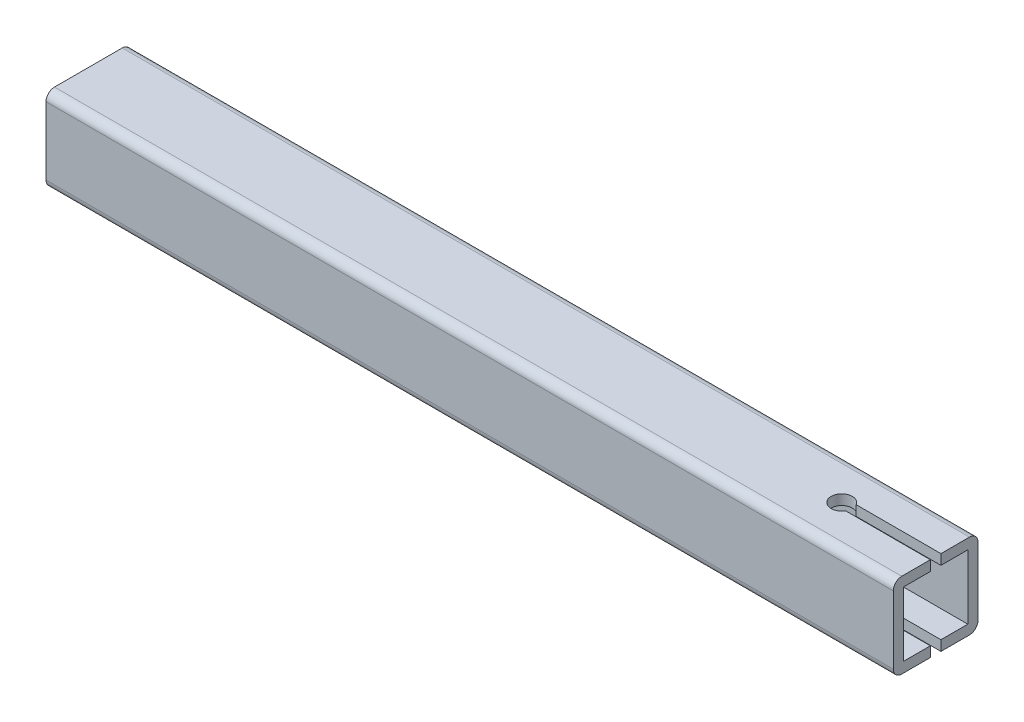
ISO-10303-21;
HEADER;
FILE_DESCRIPTION(('STEP AP214'),'2;1');
FILE_NAME('part.step','',(''),(''),'','','');
FILE_SCHEMA(('AUTOMOTIVE_DESIGN { 1 0 10303 214 1 1 1 1 }'));
ENDSEC;
DATA;
#1=APPLICATION_CONTEXT('core data for automotive mechanical design processes');
#2=APPLICATION_PROTOCOL_DEFINITION('international standard','automotive_design',2000,#1);
#3=PRODUCT_CONTEXT('',#1,'mechanical');
#4=PRODUCT('Part','Part','',(#3));
#5=PRODUCT_RELATED_PRODUCT_CATEGORY('part','',(#4));
#6=PRODUCT_DEFINITION_FORMATION('','',#4);
#7=PRODUCT_DEFINITION_CONTEXT('part definition',#1,'design');
#8=PRODUCT_DEFINITION('design','',#6,#7);
#9=PRODUCT_DEFINITION_SHAPE('','',#8);
#10=(LENGTH_UNIT() NAMED_UNIT(*) SI_UNIT(.MILLI.,.METRE.));
#11=(NAMED_UNIT(*) PLANE_ANGLE_UNIT() SI_UNIT($,.RADIAN.));
#12=(NAMED_UNIT(*) SI_UNIT($,.STERADIAN.) SOLID_ANGLE_UNIT());
#13=UNCERTAINTY_MEASURE_WITH_UNIT(LENGTH_MEASURE(1.E-05),#10,'distance_accuracy_value','');
#14=(GEOMETRIC_REPRESENTATION_CONTEXT(3) GLOBAL_UNCERTAINTY_ASSIGNED_CONTEXT((#13)) GLOBAL_UNIT_ASSIGNED_CONTEXT((#10,
#11,#12)) REPRESENTATION_CONTEXT('',''));
#15=CARTESIAN_POINT('',(0.,0.,0.));
#16=DIRECTION('',(0.,0.,1.));
#17=DIRECTION('',(1.,0.,0.));
#18=AXIS2_PLACEMENT_3D('',#15,#16,#17);
#19=CARTESIAN_POINT('',(254.,2.54,22.86));
#20=DIRECTION('',(1.,0.,0.));
#21=DIRECTION('',(0.,0.,-1.));
#22=AXIS2_PLACEMENT_3D('',#19,#20,#21);
#23=PLANE('',#22);
#24=DIRECTION('',(0.,1.,0.));
#25=VECTOR('',#24,1.);
#26=CARTESIAN_POINT('',(254.,0.,14.2875));
#27=LINE('',#26,#25);
#28=CARTESIAN_POINT('',(254.,22.352,14.2875));
#29=VERTEX_POINT('',#28);
#30=CARTESIAN_POINT('',(254.,25.4,14.2875));
#31=VERTEX_POINT('',#30);
#32=EDGE_CURVE('E333',#29,#31,#27,.T.);
#33=ORIENTED_EDGE('',*,*,#32,.T.);
#34=DIRECTION('',(0.,0.,1.));
#35=VECTOR('',#34,1.);
#36=CARTESIAN_POINT('',(254.,25.4,2.54));
#37=LINE('',#36,#35);
#38=CARTESIAN_POINT('',(254.,25.4,22.86));
#39=VERTEX_POINT('',#38);
#40=EDGE_CURVE('E253',#31,#39,#37,.T.);
#41=ORIENTED_EDGE('',*,*,#40,.T.);
#42=CARTESIAN_POINT('',(254.,22.86,22.86));
#43=DIRECTION('',(1.,0.,0.));
#44=DIRECTION('',(0.,0.,1.));
#45=AXIS2_PLACEMENT_3D('',#42,#43,#44);
#46=CIRCLE('',#45,2.54);
#47=CARTESIAN_POINT('',(254.,22.86,25.4));
#48=VERTEX_POINT('',#47);
#49=EDGE_CURVE('E257',#39,#48,#46,.T.);
#50=ORIENTED_EDGE('',*,*,#49,.T.);
#51=DIRECTION('',(0.,-1.,0.));
#52=VECTOR('',#51,1.);
#53=CARTESIAN_POINT('',(254.,22.86,25.4));
#54=LINE('',#53,#52);
#55=CARTESIAN_POINT('',(254.,2.54,25.4));
#56=VERTEX_POINT('',#55);
#57=EDGE_CURVE('E259',#48,#56,#54,.T.);
#58=ORIENTED_EDGE('',*,*,#57,.T.);
#59=CARTESIAN_POINT('',(254.,2.54,22.86));
#60=DIRECTION('',(1.,0.,0.));
#61=DIRECTION('',(0.,0.,-1.));
#62=AXIS2_PLACEMENT_3D('',#59,#60,#61);
#63=CIRCLE('',#62,2.54);
#64=CARTESIAN_POINT('',(254.,0.,22.86));
#65=VERTEX_POINT('',#64);
#66=EDGE_CURVE('E239',#56,#65,#63,.T.);
#67=ORIENTED_EDGE('',*,*,#66,.T.);
#68=DIRECTION('',(0.,0.,-1.));
#69=VECTOR('',#68,1.);
#70=CARTESIAN_POINT('',(254.,0.,22.86));
#71=LINE('',#70,#69);
#72=CARTESIAN_POINT('',(254.,0.,14.2875));
#73=VERTEX_POINT('',#72);
#74=EDGE_CURVE('E244',#65,#73,#71,.T.);
#75=ORIENTED_EDGE('',*,*,#74,.T.);
#76=CARTESIAN_POINT('',(254.,3.048,14.2875));
#77=VERTEX_POINT('',#76);
#78=EDGE_CURVE('E324',#73,#77,#27,.T.);
#79=ORIENTED_EDGE('',*,*,#78,.T.);
#80=DIRECTION('',(0.,0.,-1.));
#81=VECTOR('',#80,1.);
#82=CARTESIAN_POINT('',(254.,3.048,22.352));
#83=LINE('',#82,#81);
#84=CARTESIAN_POINT('',(254.,3.048,22.352));
#85=VERTEX_POINT('',#84);
#86=EDGE_CURVE('E217',#85,#77,#83,.T.);
#87=ORIENTED_EDGE('',*,*,#86,.F.);
#88=DIRECTION('',(0.,-1.,0.));
#89=VECTOR('',#88,1.);
#90=CARTESIAN_POINT('',(254.,22.352,22.352));
#91=LINE('',#90,#89);
#92=CARTESIAN_POINT('',(254.,22.352,22.352));
#93=VERTEX_POINT('',#92);
#94=EDGE_CURVE('E206',#93,#85,#91,.T.);
#95=ORIENTED_EDGE('',*,*,#94,.F.);
#96=DIRECTION('',(0.,0.,1.));
#97=VECTOR('',#96,1.);
#98=CARTESIAN_POINT('',(254.,22.352,3.048));
#99=LINE('',#98,#97);
#100=EDGE_CURVE('E190',#29,#93,#99,.T.);
#101=ORIENTED_EDGE('',*,*,#100,.F.);
#102=EDGE_LOOP('',(#33,#41,#50,#58,#67,#75,#79,#87,#95,#101));
#103=FACE_BOUND('',#102,.T.);
#104=ADVANCED_FACE('F47',(#103),#23,.T.);
#105=DIRECTION('',(0.,1.,0.));
#106=VECTOR('',#105,1.);
#107=CARTESIAN_POINT('',(254.,0.,11.1125));
#108=LINE('',#107,#106);
#109=CARTESIAN_POINT('',(254.,0.,11.1125));
#110=VERTEX_POINT('',#109);
#111=CARTESIAN_POINT('',(254.,3.048,11.1125));
#112=VERTEX_POINT('',#111);
#113=EDGE_CURVE('E65',#110,#112,#108,.T.);
#114=ORIENTED_EDGE('',*,*,#113,.F.);
#115=CARTESIAN_POINT('',(254.,0.,2.54000000000002));
#116=VERTEX_POINT('',#115);
#117=EDGE_CURVE('E242',#110,#116,#71,.T.);
#118=ORIENTED_EDGE('',*,*,#117,.T.);
#119=CARTESIAN_POINT('',(254.,2.54,2.54));
#120=DIRECTION('',(1.,0.,0.));
#121=DIRECTION('',(0.,0.,1.));
#122=AXIS2_PLACEMENT_3D('',#119,#120,#121);
#123=CIRCLE('',#122,2.54);
#124=CARTESIAN_POINT('',(254.,2.54000000000002,0.));
#125=VERTEX_POINT('',#124);
#126=EDGE_CURVE('E247',#116,#125,#123,.T.);
#127=ORIENTED_EDGE('',*,*,#126,.T.);
#128=DIRECTION('',(0.,1.,0.));
#129=VECTOR('',#128,1.);
#130=CARTESIAN_POINT('',(254.,2.54000000000002,0.));
#131=LINE('',#130,#129);
#132=CARTESIAN_POINT('',(254.,22.86,0.));
#133=VERTEX_POINT('',#132);
#134=EDGE_CURVE('E249',#125,#133,#131,.T.);
#135=ORIENTED_EDGE('',*,*,#134,.T.);
#136=CARTESIAN_POINT('',(254.,22.86,2.54));
#137=DIRECTION('',(1.,0.,0.));
#138=DIRECTION('',(0.,0.,-1.));
#139=AXIS2_PLACEMENT_3D('',#136,#137,#138);
#140=CIRCLE('',#139,2.54);
#141=CARTESIAN_POINT('',(254.,25.4,2.54));
#142=VERTEX_POINT('',#141);
#143=EDGE_CURVE('E251',#133,#142,#140,.T.);
#144=ORIENTED_EDGE('',*,*,#143,.T.);
#145=CARTESIAN_POINT('',(254.,25.4,11.1125));
#146=VERTEX_POINT('',#145);
#147=EDGE_CURVE('E254',#142,#146,#37,.T.);
#148=ORIENTED_EDGE('',*,*,#147,.T.);
#149=CARTESIAN_POINT('',(254.,22.352,11.1125));
#150=VERTEX_POINT('',#149);
#151=EDGE_CURVE('E312',#150,#146,#108,.T.);
#152=ORIENTED_EDGE('',*,*,#151,.F.);
#153=CARTESIAN_POINT('',(254.,22.352,3.048));
#154=VERTEX_POINT('',#153);
#155=EDGE_CURVE('E200',#154,#150,#99,.T.);
#156=ORIENTED_EDGE('',*,*,#155,.F.);
#157=DIRECTION('',(0.,1.,0.));
#158=VECTOR('',#157,1.);
#159=CARTESIAN_POINT('',(254.,3.048,3.048));
#160=LINE('',#159,#158);
#161=CARTESIAN_POINT('',(254.,3.048,3.048));
#162=VERTEX_POINT('',#161);
#163=EDGE_CURVE('E201',#162,#154,#160,.T.);
#164=ORIENTED_EDGE('',*,*,#163,.F.);
#165=EDGE_CURVE('E232',#112,#162,#83,.T.);
#166=ORIENTED_EDGE('',*,*,#165,.F.);
#167=EDGE_LOOP('',(#114,#118,#127,#135,#144,#148,#152,#156,#164,#166));
#168=FACE_BOUND('',#167,.T.);
#169=ADVANCED_FACE('F314',(#168),#23,.T.);
#170=CARTESIAN_POINT('',(0.,2.54,22.86));
#171=DIRECTION('',(1.,0.,0.));
#172=DIRECTION('',(0.,0.,-1.));
#173=AXIS2_PLACEMENT_3D('',#170,#171,#172);
#174=PLANE('',#173);
#175=CARTESIAN_POINT('',(0.,2.54,22.86));
#176=DIRECTION('',(1.,0.,0.));
#177=DIRECTION('',(0.,0.,-1.));
#178=AXIS2_PLACEMENT_3D('',#175,#176,#177);
#179=CIRCLE('',#178,2.54);
#180=CARTESIAN_POINT('',(0.,2.54,25.4));
#181=VERTEX_POINT('',#180);
#182=CARTESIAN_POINT('',(0.,0.,22.86));
#183=VERTEX_POINT('',#182);
#184=EDGE_CURVE('E238',#181,#183,#179,.T.);
#185=ORIENTED_EDGE('',*,*,#184,.F.);
#186=DIRECTION('',(0.,-1.,0.));
#187=VECTOR('',#186,1.);
#188=CARTESIAN_POINT('',(0.,22.86,25.4));
#189=LINE('',#188,#187);
#190=CARTESIAN_POINT('',(0.,22.86,25.4));
#191=VERTEX_POINT('',#190);
#192=EDGE_CURVE('E243',#191,#181,#189,.T.);
#193=ORIENTED_EDGE('',*,*,#192,.F.);
#194=CARTESIAN_POINT('',(0.,22.86,22.86));
#195=DIRECTION('',(1.,0.,0.));
#196=DIRECTION('',(0.,0.,1.));
#197=AXIS2_PLACEMENT_3D('',#194,#195,#196);
#198=CIRCLE('',#197,2.54);
#199=CARTESIAN_POINT('',(0.,25.4,22.86));
#200=VERTEX_POINT('',#199);
#201=EDGE_CURVE('E274',#200,#191,#198,.T.);
#202=ORIENTED_EDGE('',*,*,#201,.F.);
#203=DIRECTION('',(0.,0.,1.));
#204=VECTOR('',#203,1.);
#205=CARTESIAN_POINT('',(0.,25.4,2.54));
#206=LINE('',#205,#204);
#207=CARTESIAN_POINT('',(0.,25.4,2.54));
#208=VERTEX_POINT('',#207);
#209=EDGE_CURVE('E272',#208,#200,#206,.T.);
#210=ORIENTED_EDGE('',*,*,#209,.F.);
#211=CARTESIAN_POINT('',(0.,22.86,2.54));
#212=DIRECTION('',(1.,0.,0.));
#213=DIRECTION('',(0.,0.,-1.));
#214=AXIS2_PLACEMENT_3D('',#211,#212,#213);
#215=CIRCLE('',#214,2.54);
#216=CARTESIAN_POINT('',(0.,22.86,0.));
#217=VERTEX_POINT('',#216);
#218=EDGE_CURVE('E270',#217,#208,#215,.T.);
#219=ORIENTED_EDGE('',*,*,#218,.F.);
#220=DIRECTION('',(0.,1.,0.));
#221=VECTOR('',#220,1.);
#222=CARTESIAN_POINT('',(0.,2.54000000000002,0.));
#223=LINE('',#222,#221);
#224=CARTESIAN_POINT('',(0.,2.54000000000002,0.));
#225=VERTEX_POINT('',#224);
#226=EDGE_CURVE('E268',#225,#217,#223,.T.);
#227=ORIENTED_EDGE('',*,*,#226,.F.);
#228=CARTESIAN_POINT('',(0.,2.54,2.54));
#229=DIRECTION('',(1.,0.,0.));
#230=DIRECTION('',(0.,0.,1.));
#231=AXIS2_PLACEMENT_3D('',#228,#229,#230);
#232=CIRCLE('',#231,2.54);
#233=CARTESIAN_POINT('',(0.,0.,2.54000000000002));
#234=VERTEX_POINT('',#233);
#235=EDGE_CURVE('E266',#234,#225,#232,.T.);
#236=ORIENTED_EDGE('',*,*,#235,.F.);
#237=DIRECTION('',(0.,0.,-1.));
#238=VECTOR('',#237,1.);
#239=CARTESIAN_POINT('',(0.,0.,22.86));
#240=LINE('',#239,#238);
#241=EDGE_CURVE('E264',#183,#234,#240,.T.);
#242=ORIENTED_EDGE('',*,*,#241,.F.);
#243=EDGE_LOOP('',(#185,#193,#202,#210,#219,#227,#236,#242));
#244=FACE_BOUND('',#243,.T.);
#245=DIRECTION('',(0.,0.,-1.));
#246=VECTOR('',#245,1.);
#247=CARTESIAN_POINT('',(0.,3.048,22.352));
#248=LINE('',#247,#246);
#249=CARTESIAN_POINT('',(0.,3.048,22.352));
#250=VERTEX_POINT('',#249);
#251=CARTESIAN_POINT('',(0.,3.048,3.048));
#252=VERTEX_POINT('',#251);
#253=EDGE_CURVE('E223',#250,#252,#248,.T.);
#254=ORIENTED_EDGE('',*,*,#253,.T.);
#255=DIRECTION('',(0.,1.,0.));
#256=VECTOR('',#255,1.);
#257=CARTESIAN_POINT('',(0.,3.048,3.048));
#258=LINE('',#257,#256);
#259=CARTESIAN_POINT('',(0.,22.352,3.048));
#260=VERTEX_POINT('',#259);
#261=EDGE_CURVE('E226',#252,#260,#258,.T.);
#262=ORIENTED_EDGE('',*,*,#261,.T.);
#263=DIRECTION('',(0.,0.,1.));
#264=VECTOR('',#263,1.);
#265=CARTESIAN_POINT('',(0.,22.352,3.048));
#266=LINE('',#265,#264);
#267=CARTESIAN_POINT('',(0.,22.352,22.352));
#268=VERTEX_POINT('',#267);
#269=EDGE_CURVE('E230',#260,#268,#266,.T.);
#270=ORIENTED_EDGE('',*,*,#269,.T.);
#271=DIRECTION('',(0.,-1.,0.));
#272=VECTOR('',#271,1.);
#273=CARTESIAN_POINT('',(0.,22.352,22.352));
#274=LINE('',#273,#272);
#275=EDGE_CURVE('E209',#268,#250,#274,.T.);
#276=ORIENTED_EDGE('',*,*,#275,.T.);
#277=EDGE_LOOP('',(#254,#262,#270,#276));
#278=FACE_BOUND('',#277,.T.);
#279=ADVANCED_FACE('F350',(#244,#278),#174,.F.);
#280=CARTESIAN_POINT('',(254.,2.54,22.86));
#281=DIRECTION('',(-1.,0.,0.));
#282=DIRECTION('',(0.,0.,1.));
#283=AXIS2_PLACEMENT_3D('',#280,#281,#282);
#284=CYLINDRICAL_SURFACE('',#283,2.54);
#285=ORIENTED_EDGE('',*,*,#184,.T.);
#286=DIRECTION('',(-1.,0.,0.));
#287=VECTOR('',#286,1.);
#288=CARTESIAN_POINT('',(254.,0.,22.86));
#289=LINE('',#288,#287);
#290=EDGE_CURVE('E297',#65,#183,#289,.T.);
#291=ORIENTED_EDGE('',*,*,#290,.F.);
#292=ORIENTED_EDGE('',*,*,#66,.F.);
#293=DIRECTION('',(-1.,0.,0.));
#294=VECTOR('',#293,1.);
#295=CARTESIAN_POINT('',(254.,2.54,25.4));
#296=LINE('',#295,#294);
#297=EDGE_CURVE('E261',#56,#181,#296,.T.);
#298=ORIENTED_EDGE('',*,*,#297,.T.);
#299=EDGE_LOOP('',(#285,#291,#292,#298));
#300=FACE_BOUND('',#299,.T.);
#301=ADVANCED_FACE('F49',(#300),#284,.T.);
#302=CARTESIAN_POINT('',(254.,0.,22.86));
#303=DIRECTION('',(0.,1.,0.));
#304=DIRECTION('',(0.,0.,1.));
#305=AXIS2_PLACEMENT_3D('',#302,#303,#304);
#306=PLANE('',#305);
#307=CARTESIAN_POINT('',(225.850369342984,0.,12.7));
#308=DIRECTION('',(0.,1.,0.));
#309=DIRECTION('',(0.,0.,1.));
#310=AXIS2_PLACEMENT_3D('',#307,#308,#309);
#311=CIRCLE('',#310,3.17499999999999);
#312=CARTESIAN_POINT('',(228.6,0.,11.1125));
#313=VERTEX_POINT('',#312);
#314=CARTESIAN_POINT('',(228.6,0.,14.2875));
#315=VERTEX_POINT('',#314);
#316=EDGE_CURVE('E320',#313,#315,#311,.T.);
#317=ORIENTED_EDGE('',*,*,#316,.T.);
#318=DIRECTION('',(1.,0.,0.));
#319=VECTOR('',#318,1.);
#320=CARTESIAN_POINT('',(254.,0.,14.2875));
#321=LINE('',#320,#319);
#322=EDGE_CURVE('E317',#315,#73,#321,.T.);
#323=ORIENTED_EDGE('',*,*,#322,.T.);
#324=ORIENTED_EDGE('',*,*,#74,.F.);
#325=ORIENTED_EDGE('',*,*,#290,.T.);
#326=ORIENTED_EDGE('',*,*,#241,.T.);
#327=DIRECTION('',(-1.,0.,0.));
#328=VECTOR('',#327,1.);
#329=CARTESIAN_POINT('',(254.,0.,2.54000000000002));
#330=LINE('',#329,#328);
#331=EDGE_CURVE('E294',#116,#234,#330,.T.);
#332=ORIENTED_EDGE('',*,*,#331,.F.);
#333=ORIENTED_EDGE('',*,*,#117,.F.);
#334=DIRECTION('',(-1.,0.,0.));
#335=VECTOR('',#334,1.);
#336=CARTESIAN_POINT('',(254.,0.,11.1125));
#337=LINE('',#336,#335);
#338=EDGE_CURVE('E89',#110,#313,#337,.T.);
#339=ORIENTED_EDGE('',*,*,#338,.T.);
#340=EDGE_LOOP('',(#317,#323,#324,#325,#326,#332,#333,#339));
#341=FACE_BOUND('',#340,.T.);
#342=ADVANCED_FACE('F359',(#341),#306,.F.);
#343=CARTESIAN_POINT('',(254.,2.54,2.54));
#344=DIRECTION('',(-1.,0.,0.));
#345=DIRECTION('',(0.,0.,1.));
#346=AXIS2_PLACEMENT_3D('',#343,#344,#345);
#347=CYLINDRICAL_SURFACE('',#346,2.54);
#348=ORIENTED_EDGE('',*,*,#235,.T.);
#349=DIRECTION('',(-1.,0.,0.));
#350=VECTOR('',#349,1.);
#351=CARTESIAN_POINT('',(254.,2.54000000000002,0.));
#352=LINE('',#351,#350);
#353=EDGE_CURVE('E291',#125,#225,#352,.T.);
#354=ORIENTED_EDGE('',*,*,#353,.F.);
#355=ORIENTED_EDGE('',*,*,#126,.F.);
#356=ORIENTED_EDGE('',*,*,#331,.T.);
#357=EDGE_LOOP('',(#348,#354,#355,#356));
#358=FACE_BOUND('',#357,.T.);
#359=ADVANCED_FACE('F364',(#358),#347,.T.);
#360=CARTESIAN_POINT('',(254.,2.54000000000002,0.));
#361=DIRECTION('',(0.,0.,1.));
#362=DIRECTION('',(1.,0.,0.));
#363=AXIS2_PLACEMENT_3D('',#360,#361,#362);
#364=PLANE('',#363);
#365=ORIENTED_EDGE('',*,*,#226,.T.);
#366=DIRECTION('',(-1.,0.,0.));
#367=VECTOR('',#366,1.);
#368=CARTESIAN_POINT('',(254.,22.86,0.));
#369=LINE('',#368,#367);
#370=EDGE_CURVE('E288',#133,#217,#369,.T.);
#371=ORIENTED_EDGE('',*,*,#370,.F.);
#372=ORIENTED_EDGE('',*,*,#134,.F.);
#373=ORIENTED_EDGE('',*,*,#353,.T.);
#374=EDGE_LOOP('',(#365,#371,#372,#373));
#375=FACE_BOUND('',#374,.T.);
#376=ADVANCED_FACE('F370',(#375),#364,.F.);
#377=CARTESIAN_POINT('',(254.,22.86,2.54));
#378=DIRECTION('',(-1.,0.,0.));
#379=DIRECTION('',(0.,0.,1.));
#380=AXIS2_PLACEMENT_3D('',#377,#378,#379);
#381=CYLINDRICAL_SURFACE('',#380,2.54);
#382=ORIENTED_EDGE('',*,*,#218,.T.);
#383=DIRECTION('',(-1.,0.,0.));
#384=VECTOR('',#383,1.);
#385=CARTESIAN_POINT('',(254.,25.4,2.54));
#386=LINE('',#385,#384);
#387=EDGE_CURVE('E285',#142,#208,#386,.T.);
#388=ORIENTED_EDGE('',*,*,#387,.F.);
#389=ORIENTED_EDGE('',*,*,#143,.F.);
#390=ORIENTED_EDGE('',*,*,#370,.T.);
#391=EDGE_LOOP('',(#382,#388,#389,#390));
#392=FACE_BOUND('',#391,.T.);
#393=ADVANCED_FACE('F374',(#392),#381,.T.);
#394=CARTESIAN_POINT('',(254.,25.4,2.54));
#395=DIRECTION('',(0.,-1.,0.));
#396=DIRECTION('',(0.,0.,-1.));
#397=AXIS2_PLACEMENT_3D('',#394,#395,#396);
#398=PLANE('',#397);
#399=ORIENTED_EDGE('',*,*,#40,.F.);
#400=DIRECTION('',(-1.,0.,0.));
#401=VECTOR('',#400,1.);
#402=CARTESIAN_POINT('',(254.,25.4,14.2875));
#403=LINE('',#402,#401);
#404=CARTESIAN_POINT('',(228.6,25.4,14.2875));
#405=VERTEX_POINT('',#404);
#406=EDGE_CURVE('E227',#31,#405,#403,.T.);
#407=ORIENTED_EDGE('',*,*,#406,.T.);
#408=CARTESIAN_POINT('',(225.850369342984,25.4,12.7));
#409=DIRECTION('',(0.,1.,0.));
#410=DIRECTION('',(0.,0.,1.));
#411=AXIS2_PLACEMENT_3D('',#408,#409,#410);
#412=CIRCLE('',#411,3.17499999999999);
#413=CARTESIAN_POINT('',(228.6,25.4,11.1125));
#414=VERTEX_POINT('',#413);
#415=EDGE_CURVE('E51',#414,#405,#412,.T.);
#416=ORIENTED_EDGE('',*,*,#415,.F.);
#417=DIRECTION('',(1.,0.,0.));
#418=VECTOR('',#417,1.);
#419=CARTESIAN_POINT('',(254.,25.4,11.1125));
#420=LINE('',#419,#418);
#421=EDGE_CURVE('E76',#414,#146,#420,.T.);
#422=ORIENTED_EDGE('',*,*,#421,.T.);
#423=ORIENTED_EDGE('',*,*,#147,.F.);
#424=ORIENTED_EDGE('',*,*,#387,.T.);
#425=ORIENTED_EDGE('',*,*,#209,.T.);
#426=DIRECTION('',(-1.,0.,0.));
#427=VECTOR('',#426,1.);
#428=CARTESIAN_POINT('',(254.,25.4,22.86));
#429=LINE('',#428,#427);
#430=EDGE_CURVE('E282',#39,#200,#429,.T.);
#431=ORIENTED_EDGE('',*,*,#430,.F.);
#432=EDGE_LOOP('',(#399,#407,#416,#422,#423,#424,#425,#431));
#433=FACE_BOUND('',#432,.T.);
#434=ADVANCED_FACE('F378',(#433),#398,.F.);
#435=CARTESIAN_POINT('',(254.,22.86,22.86));
#436=DIRECTION('',(-1.,0.,0.));
#437=DIRECTION('',(0.,0.,1.));
#438=AXIS2_PLACEMENT_3D('',#435,#436,#437);
#439=CYLINDRICAL_SURFACE('',#438,2.54);
#440=ORIENTED_EDGE('',*,*,#201,.T.);
#441=DIRECTION('',(-1.,0.,0.));
#442=VECTOR('',#441,1.);
#443=CARTESIAN_POINT('',(254.,22.86,25.4));
#444=LINE('',#443,#442);
#445=EDGE_CURVE('E279',#48,#191,#444,.T.);
#446=ORIENTED_EDGE('',*,*,#445,.F.);
#447=ORIENTED_EDGE('',*,*,#49,.F.);
#448=ORIENTED_EDGE('',*,*,#430,.T.);
#449=EDGE_LOOP('',(#440,#446,#447,#448));
#450=FACE_BOUND('',#449,.T.);
#451=ADVANCED_FACE('F411',(#450),#439,.T.);
#452=CARTESIAN_POINT('',(254.,22.86,25.4));
#453=DIRECTION('',(0.,0.,-1.));
#454=DIRECTION('',(0.,1.,0.));
#455=AXIS2_PLACEMENT_3D('',#452,#453,#454);
#456=PLANE('',#455);
#457=ORIENTED_EDGE('',*,*,#192,.T.);
#458=ORIENTED_EDGE('',*,*,#297,.F.);
#459=ORIENTED_EDGE('',*,*,#57,.F.);
#460=ORIENTED_EDGE('',*,*,#445,.T.);
#461=EDGE_LOOP('',(#457,#458,#459,#460));
#462=FACE_BOUND('',#461,.T.);
#463=ADVANCED_FACE('F408',(#462),#456,.F.);
#464=CARTESIAN_POINT('',(254.,3.048,22.352));
#465=DIRECTION('',(0.,1.,0.));
#466=DIRECTION('',(0.,0.,1.));
#467=AXIS2_PLACEMENT_3D('',#464,#465,#466);
#468=PLANE('',#467);
#469=DIRECTION('',(1.,0.,0.));
#470=VECTOR('',#469,1.);
#471=CARTESIAN_POINT('',(254.,3.048,14.2875));
#472=LINE('',#471,#470);
#473=CARTESIAN_POINT('',(228.6,3.048,14.2875));
#474=VERTEX_POINT('',#473);
#475=EDGE_CURVE('E341',#474,#77,#472,.T.);
#476=ORIENTED_EDGE('',*,*,#475,.F.);
#477=CARTESIAN_POINT('',(225.850369342984,3.048,12.7));
#478=DIRECTION('',(0.,1.,0.));
#479=DIRECTION('',(0.,0.,1.));
#480=AXIS2_PLACEMENT_3D('',#477,#478,#479);
#481=CIRCLE('',#480,3.17499999999999);
#482=CARTESIAN_POINT('',(228.6,3.048,11.1125));
#483=VERTEX_POINT('',#482);
#484=EDGE_CURVE('E339',#483,#474,#481,.T.);
#485=ORIENTED_EDGE('',*,*,#484,.F.);
#486=DIRECTION('',(-1.,0.,0.));
#487=VECTOR('',#486,1.);
#488=CARTESIAN_POINT('',(254.,3.048,11.1125));
#489=LINE('',#488,#487);
#490=EDGE_CURVE('E336',#112,#483,#489,.T.);
#491=ORIENTED_EDGE('',*,*,#490,.F.);
#492=ORIENTED_EDGE('',*,*,#165,.T.);
#493=DIRECTION('',(-1.,0.,0.));
#494=VECTOR('',#493,1.);
#495=CARTESIAN_POINT('',(254.,3.048,3.048));
#496=LINE('',#495,#494);
#497=EDGE_CURVE('E235',#162,#252,#496,.T.);
#498=ORIENTED_EDGE('',*,*,#497,.T.);
#499=ORIENTED_EDGE('',*,*,#253,.F.);
#500=DIRECTION('',(-1.,0.,0.));
#501=VECTOR('',#500,1.);
#502=CARTESIAN_POINT('',(254.,3.048,22.352));
#503=LINE('',#502,#501);
#504=EDGE_CURVE('E212',#85,#250,#503,.T.);
#505=ORIENTED_EDGE('',*,*,#504,.F.);
#506=ORIENTED_EDGE('',*,*,#86,.T.);
#507=EDGE_LOOP('',(#476,#485,#491,#492,#498,#499,#505,#506));
#508=FACE_BOUND('',#507,.T.);
#509=ADVANCED_FACE('F353',(#508),#468,.T.);
#510=CARTESIAN_POINT('',(254.,3.048,3.048));
#511=DIRECTION('',(0.,0.,1.));
#512=DIRECTION('',(1.,0.,0.));
#513=AXIS2_PLACEMENT_3D('',#510,#511,#512);
#514=PLANE('',#513);
#515=ORIENTED_EDGE('',*,*,#261,.F.);
#516=ORIENTED_EDGE('',*,*,#497,.F.);
#517=ORIENTED_EDGE('',*,*,#163,.T.);
#518=DIRECTION('',(-1.,0.,0.));
#519=VECTOR('',#518,1.);
#520=CARTESIAN_POINT('',(254.,22.352,3.048));
#521=LINE('',#520,#519);
#522=EDGE_CURVE('E211',#154,#260,#521,.T.);
#523=ORIENTED_EDGE('',*,*,#522,.T.);
#524=EDGE_LOOP('',(#515,#516,#517,#523));
#525=FACE_BOUND('',#524,.T.);
#526=ADVANCED_FACE('F347',(#525),#514,.T.);
#527=CARTESIAN_POINT('',(254.,22.352,3.048));
#528=DIRECTION('',(0.,-1.,0.));
#529=DIRECTION('',(0.,0.,-1.));
#530=AXIS2_PLACEMENT_3D('',#527,#528,#529);
#531=PLANE('',#530);
#532=DIRECTION('',(-1.,0.,0.));
#533=VECTOR('',#532,1.);
#534=CARTESIAN_POINT('',(254.,22.352,14.2875));
#535=LINE('',#534,#533);
#536=CARTESIAN_POINT('',(228.6,22.352,14.2875));
#537=VERTEX_POINT('',#536);
#538=EDGE_CURVE('E11',#29,#537,#535,.T.);
#539=ORIENTED_EDGE('',*,*,#538,.F.);
#540=ORIENTED_EDGE('',*,*,#100,.T.);
#541=DIRECTION('',(-1.,0.,0.));
#542=VECTOR('',#541,1.);
#543=CARTESIAN_POINT('',(254.,22.352,22.352));
#544=LINE('',#543,#542);
#545=EDGE_CURVE('E194',#93,#268,#544,.T.);
#546=ORIENTED_EDGE('',*,*,#545,.T.);
#547=ORIENTED_EDGE('',*,*,#269,.F.);
#548=ORIENTED_EDGE('',*,*,#522,.F.);
#549=ORIENTED_EDGE('',*,*,#155,.T.);
#550=DIRECTION('',(1.,0.,0.));
#551=VECTOR('',#550,1.);
#552=CARTESIAN_POINT('',(254.,22.352,11.1125));
#553=LINE('',#552,#551);
#554=CARTESIAN_POINT('',(228.6,22.352,11.1125));
#555=VERTEX_POINT('',#554);
#556=EDGE_CURVE('E300',#555,#150,#553,.T.);
#557=ORIENTED_EDGE('',*,*,#556,.F.);
#558=CARTESIAN_POINT('',(225.850369342984,22.352,12.7));
#559=DIRECTION('',(0.,-1.,0.));
#560=DIRECTION('',(0.,0.,-1.));
#561=AXIS2_PLACEMENT_3D('',#558,#559,#560);
#562=CIRCLE('',#561,3.17499999999999);
#563=EDGE_CURVE('E57',#537,#555,#562,.T.);
#564=ORIENTED_EDGE('',*,*,#563,.F.);
#565=EDGE_LOOP('',(#539,#540,#546,#547,#548,#549,#557,#564));
#566=FACE_BOUND('',#565,.T.);
#567=ADVANCED_FACE('F192',(#566),#531,.T.);
#568=CARTESIAN_POINT('',(254.,22.352,22.352));
#569=DIRECTION('',(0.,0.,-1.));
#570=DIRECTION('',(0.,1.,0.));
#571=AXIS2_PLACEMENT_3D('',#568,#569,#570);
#572=PLANE('',#571);
#573=ORIENTED_EDGE('',*,*,#275,.F.);
#574=ORIENTED_EDGE('',*,*,#545,.F.);
#575=ORIENTED_EDGE('',*,*,#94,.T.);
#576=ORIENTED_EDGE('',*,*,#504,.T.);
#577=EDGE_LOOP('',(#573,#574,#575,#576));
#578=FACE_BOUND('',#577,.T.);
#579=ADVANCED_FACE('F204',(#578),#572,.T.);
#580=CARTESIAN_POINT('',(254.,0.,11.1125));
#581=DIRECTION('',(0.,0.,-1.));
#582=DIRECTION('',(-1.,0.,0.));
#583=AXIS2_PLACEMENT_3D('',#580,#581,#582);
#584=PLANE('',#583);
#585=DIRECTION('',(0.,1.,0.));
#586=VECTOR('',#585,1.);
#587=CARTESIAN_POINT('',(228.6,0.,11.1125));
#588=LINE('',#587,#586);
#589=EDGE_CURVE('E306',#555,#414,#588,.T.);
#590=ORIENTED_EDGE('',*,*,#589,.F.);
#591=ORIENTED_EDGE('',*,*,#556,.T.);
#592=ORIENTED_EDGE('',*,*,#151,.T.);
#593=ORIENTED_EDGE('',*,*,#421,.F.);
#594=EDGE_LOOP('',(#590,#591,#592,#593));
#595=FACE_BOUND('',#594,.T.);
#596=ADVANCED_FACE('F311',(#595),#584,.F.);
#597=CARTESIAN_POINT('',(225.850369342984,0.,12.7));
#598=DIRECTION('',(0.,1.,0.));
#599=DIRECTION('',(0.,0.,1.));
#600=AXIS2_PLACEMENT_3D('',#597,#598,#599);
#601=CYLINDRICAL_SURFACE('',#600,3.17499999999999);
#602=DIRECTION('',(0.,1.,0.));
#603=VECTOR('',#602,1.);
#604=CARTESIAN_POINT('',(228.6,0.,14.2875));
#605=LINE('',#604,#603);
#606=EDGE_CURVE('E83',#537,#405,#605,.T.);
#607=ORIENTED_EDGE('',*,*,#606,.F.);
#608=ORIENTED_EDGE('',*,*,#563,.T.);
#609=ORIENTED_EDGE('',*,*,#589,.T.);
#610=ORIENTED_EDGE('',*,*,#415,.T.);
#611=EDGE_LOOP('',(#607,#608,#609,#610));
#612=FACE_BOUND('',#611,.T.);
#613=ADVANCED_FACE('F305',(#612),#601,.F.);
#614=CARTESIAN_POINT('',(254.,0.,14.2875));
#615=DIRECTION('',(0.,0.,1.));
#616=DIRECTION('',(1.,0.,0.));
#617=AXIS2_PLACEMENT_3D('',#614,#615,#616);
#618=PLANE('',#617);
#619=ORIENTED_EDGE('',*,*,#32,.F.);
#620=ORIENTED_EDGE('',*,*,#538,.T.);
#621=ORIENTED_EDGE('',*,*,#606,.T.);
#622=ORIENTED_EDGE('',*,*,#406,.F.);
#623=EDGE_LOOP('',(#619,#620,#621,#622));
#624=FACE_BOUND('',#623,.T.);
#625=ADVANCED_FACE('F380',(#624),#618,.F.);
#626=ORIENTED_EDGE('',*,*,#475,.T.);
#627=ORIENTED_EDGE('',*,*,#78,.F.);
#628=ORIENTED_EDGE('',*,*,#322,.F.);
#629=EDGE_CURVE('E330',#315,#474,#605,.T.);
#630=ORIENTED_EDGE('',*,*,#629,.T.);
#631=EDGE_LOOP('',(#626,#627,#628,#630));
#632=FACE_BOUND('',#631,.T.);
#633=ADVANCED_FACE('F383',(#632),#618,.F.);
#634=ORIENTED_EDGE('',*,*,#484,.T.);
#635=ORIENTED_EDGE('',*,*,#629,.F.);
#636=ORIENTED_EDGE('',*,*,#316,.F.);
#637=EDGE_CURVE('E325',#313,#483,#588,.T.);
#638=ORIENTED_EDGE('',*,*,#637,.T.);
#639=EDGE_LOOP('',(#634,#635,#636,#638));
#640=FACE_BOUND('',#639,.T.);
#641=ADVANCED_FACE('F386',(#640),#601,.F.);
#642=ORIENTED_EDGE('',*,*,#490,.T.);
#643=ORIENTED_EDGE('',*,*,#637,.F.);
#644=ORIENTED_EDGE('',*,*,#338,.F.);
#645=ORIENTED_EDGE('',*,*,#113,.T.);
#646=EDGE_LOOP('',(#642,#643,#644,#645));
#647=FACE_BOUND('',#646,.T.);
#648=ADVANCED_FACE('F387',(#647),#584,.F.);
#649=CLOSED_SHELL('',(#104,#169,#279,#301,#342,#359,#376,#393,#434,#451,#463,#509,#526,#567,
#579,#596,#613,#625,#633,#641,#648));
#650=MANIFOLD_SOLID_BREP('B2',#649);
#651=ADVANCED_BREP_SHAPE_REPRESENTATION('',(#18,#650),#14);
#652=SHAPE_DEFINITION_REPRESENTATION(#9,#651);
ENDSEC;
END-ISO-10303-21;
